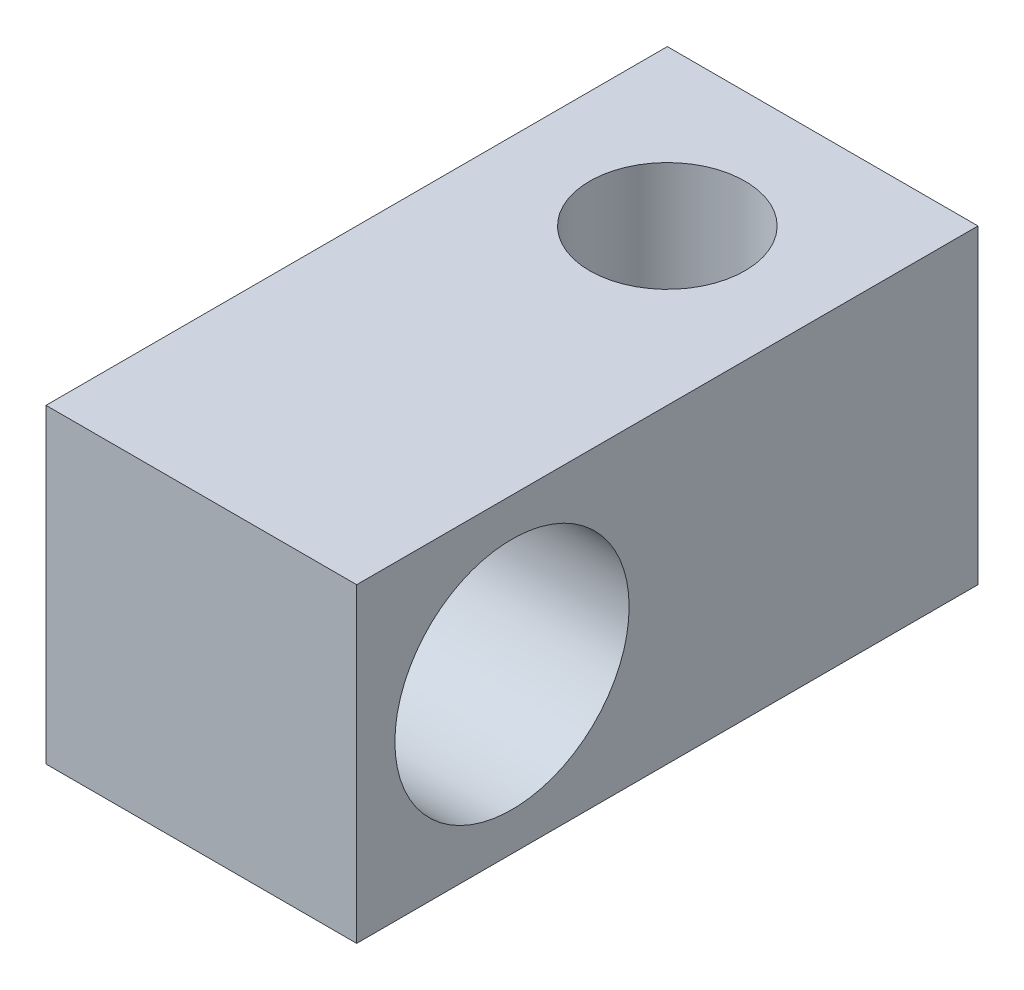
ISO-10303-21;
HEADER;
FILE_DESCRIPTION(('STEP AP214'),'2;1');
FILE_NAME('part.step','',(''),(''),'','','');
FILE_SCHEMA(('AUTOMOTIVE_DESIGN { 1 0 10303 214 1 1 1 1 }'));
ENDSEC;
DATA;
#1=APPLICATION_CONTEXT('core data for automotive mechanical design processes');
#2=APPLICATION_PROTOCOL_DEFINITION('international standard','automotive_design',2000,#1);
#3=PRODUCT_CONTEXT('',#1,'mechanical');
#4=PRODUCT('Part','Part','',(#3));
#5=PRODUCT_RELATED_PRODUCT_CATEGORY('part','',(#4));
#6=PRODUCT_DEFINITION_FORMATION('','',#4);
#7=PRODUCT_DEFINITION_CONTEXT('part definition',#1,'design');
#8=PRODUCT_DEFINITION('design','',#6,#7);
#9=PRODUCT_DEFINITION_SHAPE('','',#8);
#10=(LENGTH_UNIT() NAMED_UNIT(*) SI_UNIT(.MILLI.,.METRE.));
#11=(NAMED_UNIT(*) PLANE_ANGLE_UNIT() SI_UNIT($,.RADIAN.));
#12=(NAMED_UNIT(*) SI_UNIT($,.STERADIAN.) SOLID_ANGLE_UNIT());
#13=UNCERTAINTY_MEASURE_WITH_UNIT(LENGTH_MEASURE(1.E-05),#10,'distance_accuracy_value','');
#14=(GEOMETRIC_REPRESENTATION_CONTEXT(3) GLOBAL_UNCERTAINTY_ASSIGNED_CONTEXT((#13)) GLOBAL_UNIT_ASSIGNED_CONTEXT((#10,
#11,#12)) REPRESENTATION_CONTEXT('',''));
#15=CARTESIAN_POINT('',(0.,0.,0.));
#16=DIRECTION('',(0.,0.,1.));
#17=DIRECTION('',(1.,0.,0.));
#18=AXIS2_PLACEMENT_3D('',#15,#16,#17);
#19=CARTESIAN_POINT('',(0.,0.,100.));
#20=DIRECTION('',(1.,0.,0.));
#21=DIRECTION('',(0.,1.,0.));
#22=AXIS2_PLACEMENT_3D('',#19,#20,#21);
#23=PLANE('',#22);
#24=CARTESIAN_POINT('',(0.,25.,75.));
#25=DIRECTION('',(-1.,0.,0.));
#26=DIRECTION('',(0.,0.,1.));
#27=AXIS2_PLACEMENT_3D('',#24,#25,#26);
#28=CIRCLE('',#27,18.85);
#29=CARTESIAN_POINT('',(0.,25.,93.85));
#30=VERTEX_POINT('',#29);
#31=EDGE_CURVE('E143',#30,#30,#28,.T.);
#32=ORIENTED_EDGE('',*,*,#31,.F.);
#33=EDGE_LOOP('',(#32));
#34=FACE_BOUND('',#33,.T.);
#35=DIRECTION('',(0.,-1.,0.));
#36=VECTOR('',#35,1.);
#37=CARTESIAN_POINT('',(0.,0.,0.));
#38=LINE('',#37,#36);
#39=CARTESIAN_POINT('',(0.,50.,0.));
#40=VERTEX_POINT('',#39);
#41=CARTESIAN_POINT('',(0.,0.,0.));
#42=VERTEX_POINT('',#41);
#43=EDGE_CURVE('E111',#40,#42,#38,.T.);
#44=ORIENTED_EDGE('',*,*,#43,.T.);
#45=DIRECTION('',(0.,0.,-1.));
#46=VECTOR('',#45,1.);
#47=CARTESIAN_POINT('',(0.,0.,100.));
#48=LINE('',#47,#46);
#49=CARTESIAN_POINT('',(0.,0.,100.));
#50=VERTEX_POINT('',#49);
#51=EDGE_CURVE('E11',#50,#42,#48,.T.);
#52=ORIENTED_EDGE('',*,*,#51,.F.);
#53=DIRECTION('',(0.,-1.,0.));
#54=VECTOR('',#53,1.);
#55=CARTESIAN_POINT('',(0.,0.,100.));
#56=LINE('',#55,#54);
#57=CARTESIAN_POINT('',(0.,50.,100.));
#58=VERTEX_POINT('',#57);
#59=EDGE_CURVE('E95',#58,#50,#56,.T.);
#60=ORIENTED_EDGE('',*,*,#59,.F.);
#61=DIRECTION('',(0.,0.,-1.));
#62=VECTOR('',#61,1.);
#63=CARTESIAN_POINT('',(0.,50.,100.));
#64=LINE('',#63,#62);
#65=EDGE_CURVE('E107',#58,#40,#64,.T.);
#66=ORIENTED_EDGE('',*,*,#65,.T.);
#67=EDGE_LOOP('',(#44,#52,#60,#66));
#68=FACE_BOUND('',#67,.T.);
#69=ADVANCED_FACE('F43',(#34,#68),#23,.F.);
#70=CARTESIAN_POINT('',(0.,0.,100.));
#71=DIRECTION('',(0.,1.,0.));
#72=DIRECTION('',(0.,0.,1.));
#73=AXIS2_PLACEMENT_3D('',#70,#71,#72);
#74=PLANE('',#73);
#75=CARTESIAN_POINT('',(25.,0.,25.));
#76=DIRECTION('',(0.,1.,0.));
#77=DIRECTION('',(0.,0.,1.));
#78=AXIS2_PLACEMENT_3D('',#75,#76,#77);
#79=CIRCLE('',#78,12.5);
#80=CARTESIAN_POINT('',(25.,0.,37.5));
#81=VERTEX_POINT('',#80);
#82=EDGE_CURVE('E115',#81,#81,#79,.F.);
#83=ORIENTED_EDGE('',*,*,#82,.F.);
#84=EDGE_LOOP('',(#83));
#85=FACE_BOUND('',#84,.T.);
#86=DIRECTION('',(1.,0.,0.));
#87=VECTOR('',#86,1.);
#88=CARTESIAN_POINT('',(0.,0.,0.));
#89=LINE('',#88,#87);
#90=CARTESIAN_POINT('',(50.,0.,0.));
#91=VERTEX_POINT('',#90);
#92=EDGE_CURVE('E100',#42,#91,#89,.T.);
#93=ORIENTED_EDGE('',*,*,#92,.T.);
#94=DIRECTION('',(0.,0.,-1.));
#95=VECTOR('',#94,1.);
#96=CARTESIAN_POINT('',(50.,0.,100.));
#97=LINE('',#96,#95);
#98=CARTESIAN_POINT('',(50.,0.,100.));
#99=VERTEX_POINT('',#98);
#100=EDGE_CURVE('E52',#99,#91,#97,.T.);
#101=ORIENTED_EDGE('',*,*,#100,.F.);
#102=DIRECTION('',(1.,0.,0.));
#103=VECTOR('',#102,1.);
#104=CARTESIAN_POINT('',(0.,0.,100.));
#105=LINE('',#104,#103);
#106=EDGE_CURVE('E90',#50,#99,#105,.T.);
#107=ORIENTED_EDGE('',*,*,#106,.F.);
#108=ORIENTED_EDGE('',*,*,#51,.T.);
#109=EDGE_LOOP('',(#93,#101,#107,#108));
#110=FACE_BOUND('',#109,.T.);
#111=ADVANCED_FACE('F99',(#85,#110),#74,.F.);
#112=CARTESIAN_POINT('',(50.,0.,100.));
#113=DIRECTION('',(-1.,0.,0.));
#114=DIRECTION('',(0.,0.,1.));
#115=AXIS2_PLACEMENT_3D('',#112,#113,#114);
#116=PLANE('',#115);
#117=CARTESIAN_POINT('',(50.,25.,75.));
#118=DIRECTION('',(-1.,0.,0.));
#119=DIRECTION('',(0.,0.,1.));
#120=AXIS2_PLACEMENT_3D('',#117,#118,#119);
#121=CIRCLE('',#120,18.85);
#122=CARTESIAN_POINT('',(50.,25.,93.85));
#123=VERTEX_POINT('',#122);
#124=EDGE_CURVE('E139',#123,#123,#121,.F.);
#125=ORIENTED_EDGE('',*,*,#124,.F.);
#126=EDGE_LOOP('',(#125));
#127=FACE_BOUND('',#126,.T.);
#128=DIRECTION('',(0.,1.,0.));
#129=VECTOR('',#128,1.);
#130=CARTESIAN_POINT('',(50.,0.,0.));
#131=LINE('',#130,#129);
#132=CARTESIAN_POINT('',(50.,50.,0.));
#133=VERTEX_POINT('',#132);
#134=EDGE_CURVE('E77',#91,#133,#131,.T.);
#135=ORIENTED_EDGE('',*,*,#134,.T.);
#136=DIRECTION('',(0.,0.,-1.));
#137=VECTOR('',#136,1.);
#138=CARTESIAN_POINT('',(50.,50.,100.));
#139=LINE('',#138,#137);
#140=CARTESIAN_POINT('',(50.,50.,100.));
#141=VERTEX_POINT('',#140);
#142=EDGE_CURVE('E102',#141,#133,#139,.T.);
#143=ORIENTED_EDGE('',*,*,#142,.F.);
#144=DIRECTION('',(0.,1.,0.));
#145=VECTOR('',#144,1.);
#146=CARTESIAN_POINT('',(50.,0.,100.));
#147=LINE('',#146,#145);
#148=EDGE_CURVE('E93',#99,#141,#147,.T.);
#149=ORIENTED_EDGE('',*,*,#148,.F.);
#150=ORIENTED_EDGE('',*,*,#100,.T.);
#151=EDGE_LOOP('',(#135,#143,#149,#150));
#152=FACE_BOUND('',#151,.T.);
#153=ADVANCED_FACE('F103',(#127,#152),#116,.F.);
#154=CARTESIAN_POINT('',(0.,50.,100.));
#155=DIRECTION('',(0.,-1.,0.));
#156=DIRECTION('',(0.,0.,-1.));
#157=AXIS2_PLACEMENT_3D('',#154,#155,#156);
#158=PLANE('',#157);
#159=CARTESIAN_POINT('',(25.,50.,25.));
#160=DIRECTION('',(0.,1.,0.));
#161=DIRECTION('',(0.,0.,1.));
#162=AXIS2_PLACEMENT_3D('',#159,#160,#161);
#163=CIRCLE('',#162,12.5);
#164=CARTESIAN_POINT('',(25.,50.,37.5));
#165=VERTEX_POINT('',#164);
#166=EDGE_CURVE('E135',#165,#165,#163,.T.);
#167=ORIENTED_EDGE('',*,*,#166,.F.);
#168=EDGE_LOOP('',(#167));
#169=FACE_BOUND('',#168,.T.);
#170=DIRECTION('',(-1.,0.,0.));
#171=VECTOR('',#170,1.);
#172=CARTESIAN_POINT('',(0.,50.,0.));
#173=LINE('',#172,#171);
#174=EDGE_CURVE('E83',#133,#40,#173,.T.);
#175=ORIENTED_EDGE('',*,*,#174,.T.);
#176=ORIENTED_EDGE('',*,*,#65,.F.);
#177=DIRECTION('',(-1.,0.,0.));
#178=VECTOR('',#177,1.);
#179=CARTESIAN_POINT('',(0.,50.,100.));
#180=LINE('',#179,#178);
#181=EDGE_CURVE('E60',#141,#58,#180,.T.);
#182=ORIENTED_EDGE('',*,*,#181,.F.);
#183=ORIENTED_EDGE('',*,*,#142,.T.);
#184=EDGE_LOOP('',(#175,#176,#182,#183));
#185=FACE_BOUND('',#184,.T.);
#186=ADVANCED_FACE('F125',(#169,#185),#158,.F.);
#187=CARTESIAN_POINT('',(0.,0.,100.));
#188=DIRECTION('',(0.,0.,-1.));
#189=DIRECTION('',(-1.,0.,0.));
#190=AXIS2_PLACEMENT_3D('',#187,#188,#189);
#191=PLANE('',#190);
#192=ORIENTED_EDGE('',*,*,#59,.T.);
#193=ORIENTED_EDGE('',*,*,#106,.T.);
#194=ORIENTED_EDGE('',*,*,#148,.T.);
#195=ORIENTED_EDGE('',*,*,#181,.T.);
#196=EDGE_LOOP('',(#192,#193,#194,#195));
#197=FACE_BOUND('',#196,.T.);
#198=ADVANCED_FACE('F91',(#197),#191,.F.);
#199=CARTESIAN_POINT('',(0.,0.,0.));
#200=DIRECTION('',(0.,0.,-1.));
#201=DIRECTION('',(-1.,0.,0.));
#202=AXIS2_PLACEMENT_3D('',#199,#200,#201);
#203=PLANE('',#202);
#204=ORIENTED_EDGE('',*,*,#43,.F.);
#205=ORIENTED_EDGE('',*,*,#174,.F.);
#206=ORIENTED_EDGE('',*,*,#134,.F.);
#207=ORIENTED_EDGE('',*,*,#92,.F.);
#208=EDGE_LOOP('',(#204,#205,#206,#207));
#209=FACE_BOUND('',#208,.T.);
#210=ADVANCED_FACE('F128',(#209),#203,.T.);
#211=CARTESIAN_POINT('',(25.,-0.001000000000001,25.));
#212=DIRECTION('',(0.,1.,0.));
#213=DIRECTION('',(0.,0.,1.));
#214=AXIS2_PLACEMENT_3D('',#211,#212,#213);
#215=CYLINDRICAL_SURFACE('',#214,12.5);
#216=ORIENTED_EDGE('',*,*,#166,.T.);
#217=EDGE_LOOP('',(#216));
#218=FACE_BOUND('',#217,.T.);
#219=ORIENTED_EDGE('',*,*,#82,.T.);
#220=EDGE_LOOP('',(#219));
#221=FACE_BOUND('',#220,.T.);
#222=ADVANCED_FACE('F168',(#218,#221),#215,.F.);
#223=CARTESIAN_POINT('',(50.001,25.,75.));
#224=DIRECTION('',(-1.,0.,0.));
#225=DIRECTION('',(0.,0.,1.));
#226=AXIS2_PLACEMENT_3D('',#223,#224,#225);
#227=CYLINDRICAL_SURFACE('',#226,18.85);
#228=ORIENTED_EDGE('',*,*,#31,.T.);
#229=EDGE_LOOP('',(#228));
#230=FACE_BOUND('',#229,.T.);
#231=ORIENTED_EDGE('',*,*,#124,.T.);
#232=EDGE_LOOP('',(#231));
#233=FACE_BOUND('',#232,.T.);
#234=ADVANCED_FACE('F148',(#230,#233),#227,.F.);
#235=CLOSED_SHELL('',(#69,#111,#153,#186,#198,#210,#222,#234));
#236=MANIFOLD_SOLID_BREP('B2',#235);
#237=ADVANCED_BREP_SHAPE_REPRESENTATION('',(#18,#236),#14);
#238=SHAPE_DEFINITION_REPRESENTATION(#9,#237);
ENDSEC;
END-ISO-10303-21;
